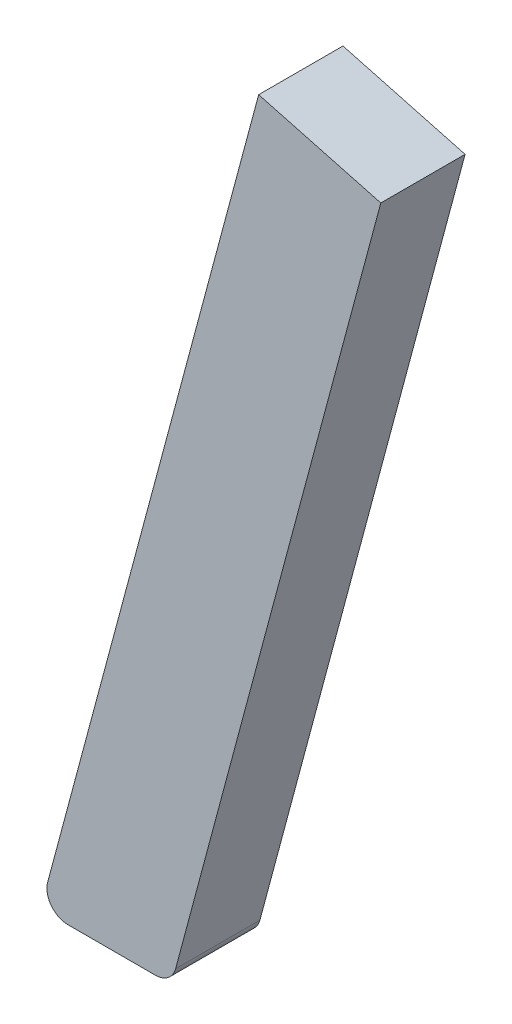
ISO-10303-21;
HEADER;
FILE_DESCRIPTION(('STEP AP214'),'2;1');
FILE_NAME('part.step','',(''),(''),'','','');
FILE_SCHEMA(('AUTOMOTIVE_DESIGN { 1 0 10303 214 1 1 1 1 }'));
ENDSEC;
DATA;
#1=APPLICATION_CONTEXT('core data for automotive mechanical design processes');
#2=APPLICATION_PROTOCOL_DEFINITION('international standard','automotive_design',2000,#1);
#3=PRODUCT_CONTEXT('',#1,'mechanical');
#4=PRODUCT('Part','Part','',(#3));
#5=PRODUCT_RELATED_PRODUCT_CATEGORY('part','',(#4));
#6=PRODUCT_DEFINITION_FORMATION('','',#4);
#7=PRODUCT_DEFINITION_CONTEXT('part definition',#1,'design');
#8=PRODUCT_DEFINITION('design','',#6,#7);
#9=PRODUCT_DEFINITION_SHAPE('','',#8);
#10=(LENGTH_UNIT() NAMED_UNIT(*) SI_UNIT(.MILLI.,.METRE.));
#11=(NAMED_UNIT(*) PLANE_ANGLE_UNIT() SI_UNIT($,.RADIAN.));
#12=(NAMED_UNIT(*) SI_UNIT($,.STERADIAN.) SOLID_ANGLE_UNIT());
#13=UNCERTAINTY_MEASURE_WITH_UNIT(LENGTH_MEASURE(1.E-05),#10,'distance_accuracy_value','');
#14=(GEOMETRIC_REPRESENTATION_CONTEXT(3) GLOBAL_UNCERTAINTY_ASSIGNED_CONTEXT((#13)) GLOBAL_UNIT_ASSIGNED_CONTEXT((#10,
#11,#12)) REPRESENTATION_CONTEXT('',''));
#15=CARTESIAN_POINT('',(0.,0.,0.));
#16=DIRECTION('',(0.,0.,1.));
#17=DIRECTION('',(1.,0.,0.));
#18=AXIS2_PLACEMENT_3D('',#15,#16,#17);
#19=CARTESIAN_POINT('',(51.7638090205049,193.185165257813,20.));
#20=DIRECTION('',(0.965925826289067,-0.258819045102525,0.));
#21=DIRECTION('',(0.258819045102525,0.965925826289067,0.));
#22=AXIS2_PLACEMENT_3D('',#19,#20,#21);
#23=PLANE('',#22);
#24=DIRECTION('',(-0.258819045102525,-0.965925826289067,0.));
#25=VECTOR('',#24,1.);
#26=CARTESIAN_POINT('',(51.7638090205049,193.185165257813,0.));
#27=LINE('',#26,#25);
#28=CARTESIAN_POINT('',(51.7638090205049,193.185165257813,0.));
#29=VERTEX_POINT('',#28);
#30=CARTESIAN_POINT('',(1.68649773276074,6.29409522551269,0.));
#31=VERTEX_POINT('',#30);
#32=EDGE_CURVE('E115',#29,#31,#27,.T.);
#33=ORIENTED_EDGE('',*,*,#32,.T.);
#34=DIRECTION('',(0.,0.,-1.));
#35=VECTOR('',#34,1.);
#36=CARTESIAN_POINT('',(1.68649773276072,6.29409522551266,20.));
#37=LINE('',#36,#35);
#38=CARTESIAN_POINT('',(1.68649773276074,6.29409522551269,20.));
#39=VERTEX_POINT('',#38);
#40=EDGE_CURVE('E11',#31,#39,#37,.F.);
#41=ORIENTED_EDGE('',*,*,#40,.T.);
#42=DIRECTION('',(-0.258819045102525,-0.965925826289067,0.));
#43=VECTOR('',#42,1.);
#44=CARTESIAN_POINT('',(51.7638090205049,193.185165257813,20.));
#45=LINE('',#44,#43);
#46=CARTESIAN_POINT('',(51.7638090205049,193.185165257813,20.));
#47=VERTEX_POINT('',#46);
#48=EDGE_CURVE('E121',#47,#39,#45,.T.);
#49=ORIENTED_EDGE('',*,*,#48,.F.);
#50=DIRECTION('',(0.,0.,-1.));
#51=VECTOR('',#50,1.);
#52=CARTESIAN_POINT('',(51.7638090205049,193.185165257813,20.));
#53=LINE('',#52,#51);
#54=EDGE_CURVE('E107',#47,#29,#53,.T.);
#55=ORIENTED_EDGE('',*,*,#54,.T.);
#56=EDGE_LOOP('',(#33,#41,#49,#55));
#57=FACE_BOUND('',#56,.T.);
#58=ADVANCED_FACE('F33',(#57),#23,.F.);
#59=CARTESIAN_POINT('',(0.,0.,20.));
#60=DIRECTION('',(0.,1.,0.));
#61=DIRECTION('',(0.,0.,1.));
#62=AXIS2_PLACEMENT_3D('',#59,#60,#61);
#63=PLANE('',#62);
#64=DIRECTION('',(1.,0.,0.));
#65=VECTOR('',#64,1.);
#66=CARTESIAN_POINT('',(0.,0.,0.));
#67=LINE('',#66,#65);
#68=CARTESIAN_POINT('',(6.51612686420605,0.,0.));
#69=VERTEX_POINT('',#68);
#70=CARTESIAN_POINT('',(27.2216504724077,0.,0.));
#71=VERTEX_POINT('',#70);
#72=EDGE_CURVE('E117',#69,#71,#67,.T.);
#73=ORIENTED_EDGE('',*,*,#72,.T.);
#74=DIRECTION('',(0.,0.,-1.));
#75=VECTOR('',#74,1.);
#76=CARTESIAN_POINT('',(27.2216504724077,0.,20.));
#77=LINE('',#76,#75);
#78=CARTESIAN_POINT('',(27.2216504724077,0.,20.));
#79=VERTEX_POINT('',#78);
#80=EDGE_CURVE('E54',#71,#79,#77,.F.);
#81=ORIENTED_EDGE('',*,*,#80,.T.);
#82=DIRECTION('',(1.,0.,0.));
#83=VECTOR('',#82,1.);
#84=CARTESIAN_POINT('',(0.,0.,20.));
#85=LINE('',#84,#83);
#86=CARTESIAN_POINT('',(6.51612686420605,0.,20.));
#87=VERTEX_POINT('',#86);
#88=EDGE_CURVE('E97',#87,#79,#85,.T.);
#89=ORIENTED_EDGE('',*,*,#88,.F.);
#90=DIRECTION('',(0.,0.,-1.));
#91=VECTOR('',#90,1.);
#92=CARTESIAN_POINT('',(6.51612686420605,0.,20.));
#93=LINE('',#92,#91);
#94=EDGE_CURVE('E128',#87,#69,#93,.T.);
#95=ORIENTED_EDGE('',*,*,#94,.T.);
#96=EDGE_LOOP('',(#73,#81,#89,#95));
#97=FACE_BOUND('',#96,.T.);
#98=ADVANCED_FACE('F136',(#97),#63,.F.);
#99=CARTESIAN_POINT('',(31.0582854123025,0.,20.));
#100=DIRECTION('',(-0.965925826289067,0.258819045102525,0.));
#101=DIRECTION('',(-0.258819045102525,-0.965925826289067,0.));
#102=AXIS2_PLACEMENT_3D('',#99,#100,#101);
#103=PLANE('',#102);
#104=DIRECTION('',(0.258819045102525,0.965925826289067,0.));
#105=VECTOR('',#104,1.);
#106=CARTESIAN_POINT('',(31.0582854123025,0.,20.));
#107=LINE('',#106,#105);
#108=CARTESIAN_POINT('',(32.0512796038531,3.70590477448738,20.));
#109=VERTEX_POINT('',#108);
#110=CARTESIAN_POINT('',(80.7415838091769,185.420593904738,20.));
#111=VERTEX_POINT('',#110);
#112=EDGE_CURVE('E87',#109,#111,#107,.T.);
#113=ORIENTED_EDGE('',*,*,#112,.F.);
#114=DIRECTION('',(0.,0.,-1.));
#115=VECTOR('',#114,1.);
#116=CARTESIAN_POINT('',(32.0512796038531,3.70590477448738,20.));
#117=LINE('',#116,#115);
#118=CARTESIAN_POINT('',(32.0512796038531,3.70590477448738,0.));
#119=VERTEX_POINT('',#118);
#120=EDGE_CURVE('E106',#109,#119,#117,.T.);
#121=ORIENTED_EDGE('',*,*,#120,.T.);
#122=DIRECTION('',(0.258819045102525,0.965925826289067,0.));
#123=VECTOR('',#122,1.);
#124=CARTESIAN_POINT('',(31.0582854123025,0.,0.));
#125=LINE('',#124,#123);
#126=CARTESIAN_POINT('',(80.7415838091769,185.420593904738,0.));
#127=VERTEX_POINT('',#126);
#128=EDGE_CURVE('E103',#119,#127,#125,.T.);
#129=ORIENTED_EDGE('',*,*,#128,.T.);
#130=DIRECTION('',(0.,0.,-1.));
#131=VECTOR('',#130,1.);
#132=CARTESIAN_POINT('',(80.7415838091769,185.420593904738,20.));
#133=LINE('',#132,#131);
#134=EDGE_CURVE('E100',#111,#127,#133,.T.);
#135=ORIENTED_EDGE('',*,*,#134,.F.);
#136=EDGE_LOOP('',(#113,#121,#129,#135));
#137=FACE_BOUND('',#136,.T.);
#138=ADVANCED_FACE('F101',(#137),#103,.F.);
#139=CARTESIAN_POINT('',(80.7415838091769,185.420593904738,20.));
#140=DIRECTION('',(-0.258819045102527,-0.965925826289066,0.));
#141=DIRECTION('',(0.965925826289067,-0.258819045102528,0.));
#142=AXIS2_PLACEMENT_3D('',#139,#140,#141);
#143=PLANE('',#142);
#144=DIRECTION('',(-0.965925826289066,0.258819045102527,0.));
#145=VECTOR('',#144,1.);
#146=CARTESIAN_POINT('',(80.7415838091769,185.420593904738,0.));
#147=LINE('',#146,#145);
#148=EDGE_CURVE('E120',#127,#29,#147,.T.);
#149=ORIENTED_EDGE('',*,*,#148,.T.);
#150=ORIENTED_EDGE('',*,*,#54,.F.);
#151=DIRECTION('',(-0.965925826289066,0.258819045102527,0.));
#152=VECTOR('',#151,1.);
#153=CARTESIAN_POINT('',(80.7415838091769,185.420593904738,20.));
#154=LINE('',#153,#152);
#155=EDGE_CURVE('E91',#111,#47,#154,.T.);
#156=ORIENTED_EDGE('',*,*,#155,.F.);
#157=ORIENTED_EDGE('',*,*,#134,.T.);
#158=EDGE_LOOP('',(#149,#150,#156,#157));
#159=FACE_BOUND('',#158,.T.);
#160=ADVANCED_FACE('F109',(#159),#143,.F.);
#161=CARTESIAN_POINT('',(0.,0.,20.));
#162=DIRECTION('',(0.,0.,-1.));
#163=DIRECTION('',(-1.,0.,0.));
#164=AXIS2_PLACEMENT_3D('',#161,#162,#163);
#165=PLANE('',#164);
#166=ORIENTED_EDGE('',*,*,#88,.T.);
#167=CARTESIAN_POINT('',(27.2216504724077,5.,20.));
#168=DIRECTION('',(0.,0.,-1.));
#169=DIRECTION('',(-1.,0.,0.));
#170=AXIS2_PLACEMENT_3D('',#167,#168,#169);
#171=CIRCLE('',#170,5.);
#172=EDGE_CURVE('E41',#79,#109,#171,.F.);
#173=ORIENTED_EDGE('',*,*,#172,.T.);
#174=ORIENTED_EDGE('',*,*,#112,.T.);
#175=ORIENTED_EDGE('',*,*,#155,.T.);
#176=ORIENTED_EDGE('',*,*,#48,.T.);
#177=CARTESIAN_POINT('',(6.51612686420605,5.,20.));
#178=DIRECTION('',(0.,0.,-1.));
#179=DIRECTION('',(-1.,0.,0.));
#180=AXIS2_PLACEMENT_3D('',#177,#178,#179);
#181=CIRCLE('',#180,5.);
#182=EDGE_CURVE('E132',#39,#87,#181,.F.);
#183=ORIENTED_EDGE('',*,*,#182,.T.);
#184=EDGE_LOOP('',(#166,#173,#174,#175,#176,#183));
#185=FACE_BOUND('',#184,.T.);
#186=ADVANCED_FACE('F89',(#185),#165,.F.);
#187=CARTESIAN_POINT('',(0.,0.,0.));
#188=DIRECTION('',(0.,0.,-1.));
#189=DIRECTION('',(-1.,0.,0.));
#190=AXIS2_PLACEMENT_3D('',#187,#188,#189);
#191=PLANE('',#190);
#192=ORIENTED_EDGE('',*,*,#128,.F.);
#193=CARTESIAN_POINT('',(27.2216504724077,5.,0.));
#194=DIRECTION('',(0.,0.,-1.));
#195=DIRECTION('',(-1.,0.,0.));
#196=AXIS2_PLACEMENT_3D('',#193,#194,#195);
#197=CIRCLE('',#196,5.);
#198=EDGE_CURVE('E126',#119,#71,#197,.T.);
#199=ORIENTED_EDGE('',*,*,#198,.T.);
#200=ORIENTED_EDGE('',*,*,#72,.F.);
#201=CARTESIAN_POINT('',(6.51612686420605,5.,0.));
#202=DIRECTION('',(0.,0.,-1.));
#203=DIRECTION('',(-1.,0.,0.));
#204=AXIS2_PLACEMENT_3D('',#201,#202,#203);
#205=CIRCLE('',#204,5.);
#206=EDGE_CURVE('E124',#69,#31,#205,.T.);
#207=ORIENTED_EDGE('',*,*,#206,.T.);
#208=ORIENTED_EDGE('',*,*,#32,.F.);
#209=ORIENTED_EDGE('',*,*,#148,.F.);
#210=EDGE_LOOP('',(#192,#199,#200,#207,#208,#209));
#211=FACE_BOUND('',#210,.T.);
#212=ADVANCED_FACE('F140',(#211),#191,.T.);
#213=CARTESIAN_POINT('',(27.2216504724077,5.,20.));
#214=DIRECTION('',(0.,0.,-1.));
#215=DIRECTION('',(-1.,0.,0.));
#216=AXIS2_PLACEMENT_3D('',#213,#214,#215);
#217=CYLINDRICAL_SURFACE('',#216,5.);
#218=ORIENTED_EDGE('',*,*,#172,.F.);
#219=ORIENTED_EDGE('',*,*,#80,.F.);
#220=ORIENTED_EDGE('',*,*,#198,.F.);
#221=ORIENTED_EDGE('',*,*,#120,.F.);
#222=EDGE_LOOP('',(#218,#219,#220,#221));
#223=FACE_BOUND('',#222,.T.);
#224=ADVANCED_FACE('F149',(#223),#217,.T.);
#225=CARTESIAN_POINT('',(6.51612686420605,5.,20.));
#226=DIRECTION('',(0.,0.,-1.));
#227=DIRECTION('',(-1.,0.,0.));
#228=AXIS2_PLACEMENT_3D('',#225,#226,#227);
#229=CYLINDRICAL_SURFACE('',#228,5.);
#230=ORIENTED_EDGE('',*,*,#182,.F.);
#231=ORIENTED_EDGE('',*,*,#40,.F.);
#232=ORIENTED_EDGE('',*,*,#206,.F.);
#233=ORIENTED_EDGE('',*,*,#94,.F.);
#234=EDGE_LOOP('',(#230,#231,#232,#233));
#235=FACE_BOUND('',#234,.T.);
#236=ADVANCED_FACE('F35',(#235),#229,.T.);
#237=CLOSED_SHELL('',(#58,#98,#138,#160,#186,#212,#224,#236));
#238=MANIFOLD_SOLID_BREP('B2',#237);
#239=ADVANCED_BREP_SHAPE_REPRESENTATION('',(#18,#238),#14);
#240=SHAPE_DEFINITION_REPRESENTATION(#9,#239);
ENDSEC;
END-ISO-10303-21;
